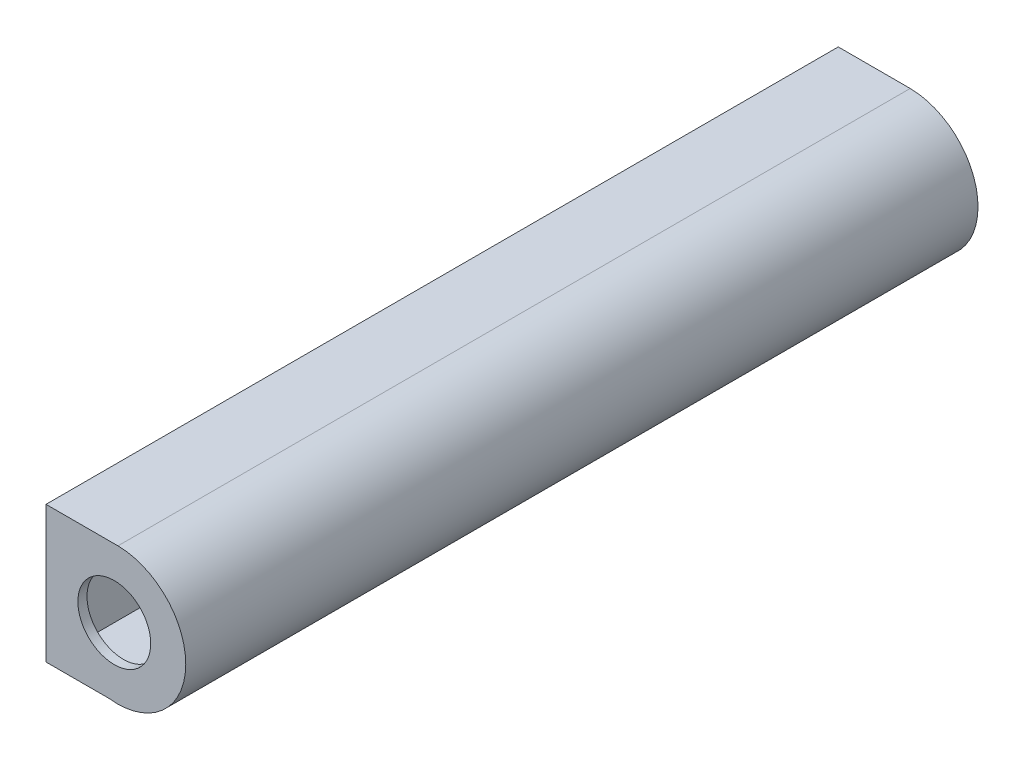
ISO-10303-21;
HEADER;
FILE_DESCRIPTION(('STEP AP214'),'2;1');
FILE_NAME('part.step','',(''),(''),'','','');
FILE_SCHEMA(('AUTOMOTIVE_DESIGN { 1 0 10303 214 1 1 1 1 }'));
ENDSEC;
DATA;
#1=APPLICATION_CONTEXT('core data for automotive mechanical design processes');
#2=APPLICATION_PROTOCOL_DEFINITION('international standard','automotive_design',2000,#1);
#3=PRODUCT_CONTEXT('',#1,'mechanical');
#4=PRODUCT('Part','Part','',(#3));
#5=PRODUCT_RELATED_PRODUCT_CATEGORY('part','',(#4));
#6=PRODUCT_DEFINITION_FORMATION('','',#4);
#7=PRODUCT_DEFINITION_CONTEXT('part definition',#1,'design');
#8=PRODUCT_DEFINITION('design','',#6,#7);
#9=PRODUCT_DEFINITION_SHAPE('','',#8);
#10=(LENGTH_UNIT() NAMED_UNIT(*) SI_UNIT(.MILLI.,.METRE.));
#11=(NAMED_UNIT(*) PLANE_ANGLE_UNIT() SI_UNIT($,.RADIAN.));
#12=(NAMED_UNIT(*) SI_UNIT($,.STERADIAN.) SOLID_ANGLE_UNIT());
#13=UNCERTAINTY_MEASURE_WITH_UNIT(LENGTH_MEASURE(1.E-05),#10,'distance_accuracy_value','');
#14=(GEOMETRIC_REPRESENTATION_CONTEXT(3) GLOBAL_UNCERTAINTY_ASSIGNED_CONTEXT((#13)) GLOBAL_UNIT_ASSIGNED_CONTEXT((#10,
#11,#12)) REPRESENTATION_CONTEXT('',''));
#15=CARTESIAN_POINT('',(0.,0.,0.));
#16=DIRECTION('',(0.,0.,1.));
#17=DIRECTION('',(1.,0.,0.));
#18=AXIS2_PLACEMENT_3D('',#15,#16,#17);
#19=CARTESIAN_POINT('',(-5.75945058146045,6.34315895413528,87.));
#20=DIRECTION('',(0.,0.,-1.));
#21=DIRECTION('',(-1.,0.,0.));
#22=AXIS2_PLACEMENT_3D('',#19,#20,#21);
#23=PLANE('',#22);
#24=CARTESIAN_POINT('',(-5.75945058146045,6.34315895413528,87.));
#25=DIRECTION('',(0.,0.,1.));
#26=DIRECTION('',(-1.,0.,0.));
#27=AXIS2_PLACEMENT_3D('',#24,#25,#26);
#28=CIRCLE('',#27,7.52928691900203);
#29=CARTESIAN_POINT('',(-6.69306965798514,-1.12802013143109,87.));
#30=VERTEX_POINT('',#29);
#31=CARTESIAN_POINT('',(-5.67568216830907,13.8719798685689,87.));
#32=VERTEX_POINT('',#31);
#33=EDGE_CURVE('E156',#30,#32,#28,.T.);
#34=ORIENTED_EDGE('',*,*,#33,.T.);
#35=DIRECTION('',(-1.,0.,0.));
#36=VECTOR('',#35,1.);
#37=CARTESIAN_POINT('',(-5.67568216830907,13.8719798685689,87.));
#38=LINE('',#37,#36);
#39=CARTESIAN_POINT('',(-13.5774526724239,13.8719798685689,87.));
#40=VERTEX_POINT('',#39);
#41=EDGE_CURVE('E160',#32,#40,#38,.T.);
#42=ORIENTED_EDGE('',*,*,#41,.T.);
#43=DIRECTION('',(0.,-1.,0.));
#44=VECTOR('',#43,1.);
#45=CARTESIAN_POINT('',(-13.5774526724239,13.8719798685689,87.));
#46=LINE('',#45,#44);
#47=CARTESIAN_POINT('',(-13.5774526724239,-1.12802013143109,87.));
#48=VERTEX_POINT('',#47);
#49=EDGE_CURVE('E163',#40,#48,#46,.T.);
#50=ORIENTED_EDGE('',*,*,#49,.T.);
#51=DIRECTION('',(1.,0.,0.));
#52=VECTOR('',#51,1.);
#53=CARTESIAN_POINT('',(-13.5774526724239,-1.12802013143109,87.));
#54=LINE('',#53,#52);
#55=EDGE_CURVE('E152',#48,#30,#54,.T.);
#56=ORIENTED_EDGE('',*,*,#55,.T.);
#57=EDGE_LOOP('',(#34,#42,#50,#56));
#58=FACE_BOUND('',#57,.T.);
#59=CARTESIAN_POINT('',(-6.07745267242387,6.37197986856891,87.));
#60=DIRECTION('',(0.,0.,1.));
#61=DIRECTION('',(1.,0.,0.));
#62=AXIS2_PLACEMENT_3D('',#59,#60,#61);
#63=CIRCLE('',#62,4.);
#64=CARTESIAN_POINT('',(-2.07745267242387,6.37197986856891,87.));
#65=VERTEX_POINT('',#64);
#66=EDGE_CURVE('E216',#65,#65,#63,.T.);
#67=ORIENTED_EDGE('',*,*,#66,.F.);
#68=EDGE_LOOP('',(#67));
#69=FACE_BOUND('',#68,.T.);
#70=ADVANCED_FACE('F39',(#58,#69),#23,.F.);
#71=CARTESIAN_POINT('',(-5.75945058146045,6.34315895413528,0.));
#72=DIRECTION('',(0.,0.,-1.));
#73=DIRECTION('',(-1.,0.,0.));
#74=AXIS2_PLACEMENT_3D('',#71,#72,#73);
#75=PLANE('',#74);
#76=DIRECTION('',(1.,0.,0.));
#77=VECTOR('',#76,1.);
#78=CARTESIAN_POINT('',(-13.5774526724239,-1.12802013143109,0.));
#79=LINE('',#78,#77);
#80=CARTESIAN_POINT('',(-13.5774526724239,-1.12802013143109,0.));
#81=VERTEX_POINT('',#80);
#82=CARTESIAN_POINT('',(-6.69306965798514,-1.12802013143109,0.));
#83=VERTEX_POINT('',#82);
#84=EDGE_CURVE('E151',#81,#83,#79,.T.);
#85=ORIENTED_EDGE('',*,*,#84,.F.);
#86=DIRECTION('',(0.,-1.,0.));
#87=VECTOR('',#86,1.);
#88=CARTESIAN_POINT('',(-13.5774526724239,13.8719798685689,0.));
#89=LINE('',#88,#87);
#90=CARTESIAN_POINT('',(-13.5774526724239,13.8719798685689,0.));
#91=VERTEX_POINT('',#90);
#92=EDGE_CURVE('E157',#91,#81,#89,.T.);
#93=ORIENTED_EDGE('',*,*,#92,.F.);
#94=DIRECTION('',(-1.,0.,0.));
#95=VECTOR('',#94,1.);
#96=CARTESIAN_POINT('',(-5.67568216830907,13.8719798685689,0.));
#97=LINE('',#96,#95);
#98=CARTESIAN_POINT('',(-5.67568216830907,13.8719798685689,0.));
#99=VERTEX_POINT('',#98);
#100=EDGE_CURVE('E174',#99,#91,#97,.T.);
#101=ORIENTED_EDGE('',*,*,#100,.F.);
#102=CARTESIAN_POINT('',(-5.75945058146045,6.34315895413528,0.));
#103=DIRECTION('',(0.,0.,1.));
#104=DIRECTION('',(-1.,0.,0.));
#105=AXIS2_PLACEMENT_3D('',#102,#103,#104);
#106=CIRCLE('',#105,7.52928691900203);
#107=EDGE_CURVE('E170',#83,#99,#106,.T.);
#108=ORIENTED_EDGE('',*,*,#107,.F.);
#109=EDGE_LOOP('',(#85,#93,#101,#108));
#110=FACE_BOUND('',#109,.T.);
#111=DIRECTION('',(1.,0.,0.));
#112=VECTOR('',#111,1.);
#113=CARTESIAN_POINT('',(-12.0774526724239,0.371979868568912,0.));
#114=LINE('',#113,#112);
#115=CARTESIAN_POINT('',(-12.0774526724239,0.371979868568912,0.));
#116=VERTEX_POINT('',#115);
#117=CARTESIAN_POINT('',(-5.87745267242388,0.371979868568913,0.));
#118=VERTEX_POINT('',#117);
#119=EDGE_CURVE('E109',#116,#118,#114,.T.);
#120=ORIENTED_EDGE('',*,*,#119,.T.);
#121=CARTESIAN_POINT('',(-5.87745267242387,6.37197986856891,0.));
#122=DIRECTION('',(0.,0.,1.));
#123=DIRECTION('',(1.,0.,0.));
#124=AXIS2_PLACEMENT_3D('',#121,#122,#123);
#125=CIRCLE('',#124,6.);
#126=CARTESIAN_POINT('',(-5.87745267242387,12.3719798685689,0.));
#127=VERTEX_POINT('',#126);
#128=EDGE_CURVE('E127',#118,#127,#125,.T.);
#129=ORIENTED_EDGE('',*,*,#128,.T.);
#130=DIRECTION('',(-1.,0.,0.));
#131=VECTOR('',#130,1.);
#132=CARTESIAN_POINT('',(-12.0774526724239,12.3719798685689,0.));
#133=LINE('',#132,#131);
#134=CARTESIAN_POINT('',(-12.0774526724239,12.3719798685689,0.));
#135=VERTEX_POINT('',#134);
#136=EDGE_CURVE('E132',#127,#135,#133,.T.);
#137=ORIENTED_EDGE('',*,*,#136,.T.);
#138=DIRECTION('',(0.,-1.,0.));
#139=VECTOR('',#138,1.);
#140=CARTESIAN_POINT('',(-12.0774526724239,12.3719798685689,0.));
#141=LINE('',#140,#139);
#142=EDGE_CURVE('E139',#135,#116,#141,.T.);
#143=ORIENTED_EDGE('',*,*,#142,.T.);
#144=EDGE_LOOP('',(#120,#129,#137,#143));
#145=FACE_BOUND('',#144,.T.);
#146=ADVANCED_FACE('F199',(#110,#145),#75,.T.);
#147=CARTESIAN_POINT('',(-13.5774526724239,-1.12802013143109,87.));
#148=DIRECTION('',(0.,1.,0.));
#149=DIRECTION('',(0.,0.,1.));
#150=AXIS2_PLACEMENT_3D('',#147,#148,#149);
#151=PLANE('',#150);
#152=ORIENTED_EDGE('',*,*,#84,.T.);
#153=DIRECTION('',(0.,0.,-1.));
#154=VECTOR('',#153,1.);
#155=CARTESIAN_POINT('',(-6.69306965798514,-1.12802013143109,87.));
#156=LINE('',#155,#154);
#157=EDGE_CURVE('E48',#30,#83,#156,.T.);
#158=ORIENTED_EDGE('',*,*,#157,.F.);
#159=ORIENTED_EDGE('',*,*,#55,.F.);
#160=DIRECTION('',(0.,0.,-1.));
#161=VECTOR('',#160,1.);
#162=CARTESIAN_POINT('',(-13.5774526724239,-1.12802013143109,87.));
#163=LINE('',#162,#161);
#164=EDGE_CURVE('E166',#48,#81,#163,.T.);
#165=ORIENTED_EDGE('',*,*,#164,.T.);
#166=EDGE_LOOP('',(#152,#158,#159,#165));
#167=FACE_BOUND('',#166,.T.);
#168=ADVANCED_FACE('F41',(#167),#151,.F.);
#169=CARTESIAN_POINT('',(-5.75945058146045,6.34315895413528,87.));
#170=DIRECTION('',(0.,0.,-1.));
#171=DIRECTION('',(-1.,0.,0.));
#172=AXIS2_PLACEMENT_3D('',#169,#170,#171);
#173=CYLINDRICAL_SURFACE('',#172,7.52928691900203);
#174=DIRECTION('',(0.,0.,-1.));
#175=VECTOR('',#174,1.);
#176=CARTESIAN_POINT('',(-5.67568216830907,13.8719798685689,87.));
#177=LINE('',#176,#175);
#178=EDGE_CURVE('E186',#32,#99,#177,.T.);
#179=ORIENTED_EDGE('',*,*,#178,.F.);
#180=ORIENTED_EDGE('',*,*,#33,.F.);
#181=ORIENTED_EDGE('',*,*,#157,.T.);
#182=ORIENTED_EDGE('',*,*,#107,.T.);
#183=EDGE_LOOP('',(#179,#180,#181,#182));
#184=FACE_BOUND('',#183,.T.);
#185=ADVANCED_FACE('F193',(#184),#173,.T.);
#186=CARTESIAN_POINT('',(-5.67568216830907,13.8719798685689,87.));
#187=DIRECTION('',(0.,-1.,0.));
#188=DIRECTION('',(0.,0.,-1.));
#189=AXIS2_PLACEMENT_3D('',#186,#187,#188);
#190=PLANE('',#189);
#191=ORIENTED_EDGE('',*,*,#100,.T.);
#192=DIRECTION('',(0.,0.,-1.));
#193=VECTOR('',#192,1.);
#194=CARTESIAN_POINT('',(-13.5774526724239,13.8719798685689,87.));
#195=LINE('',#194,#193);
#196=EDGE_CURVE('E183',#40,#91,#195,.T.);
#197=ORIENTED_EDGE('',*,*,#196,.F.);
#198=ORIENTED_EDGE('',*,*,#41,.F.);
#199=ORIENTED_EDGE('',*,*,#178,.T.);
#200=EDGE_LOOP('',(#191,#197,#198,#199));
#201=FACE_BOUND('',#200,.T.);
#202=ADVANCED_FACE('F209',(#201),#190,.F.);
#203=CARTESIAN_POINT('',(-13.5774526724239,13.8719798685689,87.));
#204=DIRECTION('',(1.,0.,0.));
#205=DIRECTION('',(0.,0.,-1.));
#206=AXIS2_PLACEMENT_3D('',#203,#204,#205);
#207=PLANE('',#206);
#208=ORIENTED_EDGE('',*,*,#92,.T.);
#209=ORIENTED_EDGE('',*,*,#164,.F.);
#210=ORIENTED_EDGE('',*,*,#49,.F.);
#211=ORIENTED_EDGE('',*,*,#196,.T.);
#212=EDGE_LOOP('',(#208,#209,#210,#211));
#213=FACE_BOUND('',#212,.T.);
#214=ADVANCED_FACE('F205',(#213),#207,.F.);
#215=CARTESIAN_POINT('',(-5.87745267242387,6.37197986856891,87.));
#216=DIRECTION('',(0.,0.,-1.));
#217=DIRECTION('',(-1.,0.,0.));
#218=AXIS2_PLACEMENT_3D('',#215,#216,#217);
#219=CYLINDRICAL_SURFACE('',#218,6.);
#220=CARTESIAN_POINT('',(-5.87745267242387,6.37197986856891,86.));
#221=DIRECTION('',(0.,0.,-1.));
#222=DIRECTION('',(-1.,0.,0.));
#223=AXIS2_PLACEMENT_3D('',#220,#221,#222);
#224=CIRCLE('',#223,6.);
#225=CARTESIAN_POINT('',(-5.87745267242387,12.3719798685689,86.));
#226=VERTEX_POINT('',#225);
#227=CARTESIAN_POINT('',(-5.87745267242388,0.371979868568913,86.));
#228=VERTEX_POINT('',#227);
#229=EDGE_CURVE('E55',#226,#228,#224,.T.);
#230=ORIENTED_EDGE('',*,*,#229,.F.);
#231=DIRECTION('',(0.,0.,-1.));
#232=VECTOR('',#231,1.);
#233=CARTESIAN_POINT('',(-5.87745267242387,12.3719798685689,87.));
#234=LINE('',#233,#232);
#235=EDGE_CURVE('E148',#226,#127,#234,.T.);
#236=ORIENTED_EDGE('',*,*,#235,.T.);
#237=ORIENTED_EDGE('',*,*,#128,.F.);
#238=DIRECTION('',(0.,0.,-1.));
#239=VECTOR('',#238,1.);
#240=CARTESIAN_POINT('',(-5.87745267242388,0.371979868568913,87.));
#241=LINE('',#240,#239);
#242=EDGE_CURVE('E115',#228,#118,#241,.T.);
#243=ORIENTED_EDGE('',*,*,#242,.F.);
#244=EDGE_LOOP('',(#230,#236,#237,#243));
#245=FACE_BOUND('',#244,.T.);
#246=ADVANCED_FACE('F240',(#245),#219,.F.);
#247=CARTESIAN_POINT('',(-12.0774526724239,12.3719798685689,87.));
#248=DIRECTION('',(0.,-1.,0.));
#249=DIRECTION('',(1.,0.,0.));
#250=AXIS2_PLACEMENT_3D('',#247,#248,#249);
#251=PLANE('',#250);
#252=DIRECTION('',(1.,0.,0.));
#253=VECTOR('',#252,1.);
#254=CARTESIAN_POINT('',(-12.0774526724239,12.3719798685689,86.));
#255=LINE('',#254,#253);
#256=CARTESIAN_POINT('',(-12.0774526724239,12.3719798685689,86.));
#257=VERTEX_POINT('',#256);
#258=EDGE_CURVE('E62',#257,#226,#255,.T.);
#259=ORIENTED_EDGE('',*,*,#258,.F.);
#260=DIRECTION('',(0.,0.,-1.));
#261=VECTOR('',#260,1.);
#262=CARTESIAN_POINT('',(-12.0774526724239,12.3719798685689,87.));
#263=LINE('',#262,#261);
#264=EDGE_CURVE('E114',#257,#135,#263,.T.);
#265=ORIENTED_EDGE('',*,*,#264,.T.);
#266=ORIENTED_EDGE('',*,*,#136,.F.);
#267=ORIENTED_EDGE('',*,*,#235,.F.);
#268=EDGE_LOOP('',(#259,#265,#266,#267));
#269=FACE_BOUND('',#268,.T.);
#270=ADVANCED_FACE('F237',(#269),#251,.T.);
#271=CARTESIAN_POINT('',(-12.0774526724239,12.3719798685689,87.));
#272=DIRECTION('',(1.,0.,0.));
#273=DIRECTION('',(0.,1.,0.));
#274=AXIS2_PLACEMENT_3D('',#271,#272,#273);
#275=PLANE('',#274);
#276=DIRECTION('',(0.,1.,0.));
#277=VECTOR('',#276,1.);
#278=CARTESIAN_POINT('',(-12.0774526724239,12.3719798685689,86.));
#279=LINE('',#278,#277);
#280=CARTESIAN_POINT('',(-12.0774526724239,0.371979868568912,86.));
#281=VERTEX_POINT('',#280);
#282=EDGE_CURVE('E118',#281,#257,#279,.T.);
#283=ORIENTED_EDGE('',*,*,#282,.F.);
#284=DIRECTION('',(0.,0.,-1.));
#285=VECTOR('',#284,1.);
#286=CARTESIAN_POINT('',(-12.0774526724239,0.371979868568912,87.));
#287=LINE('',#286,#285);
#288=EDGE_CURVE('E105',#281,#116,#287,.T.);
#289=ORIENTED_EDGE('',*,*,#288,.T.);
#290=ORIENTED_EDGE('',*,*,#142,.F.);
#291=ORIENTED_EDGE('',*,*,#264,.F.);
#292=EDGE_LOOP('',(#283,#289,#290,#291));
#293=FACE_BOUND('',#292,.T.);
#294=ADVANCED_FACE('F119',(#293),#275,.T.);
#295=CARTESIAN_POINT('',(-12.0774526724239,0.371979868568912,87.));
#296=DIRECTION('',(0.,1.,0.));
#297=DIRECTION('',(-1.,0.,0.));
#298=AXIS2_PLACEMENT_3D('',#295,#296,#297);
#299=PLANE('',#298);
#300=DIRECTION('',(-1.,0.,0.));
#301=VECTOR('',#300,1.);
#302=CARTESIAN_POINT('',(-12.0774526724239,0.371979868568912,86.));
#303=LINE('',#302,#301);
#304=EDGE_CURVE('E11',#228,#281,#303,.T.);
#305=ORIENTED_EDGE('',*,*,#304,.F.);
#306=ORIENTED_EDGE('',*,*,#242,.T.);
#307=ORIENTED_EDGE('',*,*,#119,.F.);
#308=ORIENTED_EDGE('',*,*,#288,.F.);
#309=EDGE_LOOP('',(#305,#306,#307,#308));
#310=FACE_BOUND('',#309,.T.);
#311=ADVANCED_FACE('F107',(#310),#299,.T.);
#312=CARTESIAN_POINT('',(-5.75945058146045,6.34315895413528,86.));
#313=DIRECTION('',(0.,0.,-1.));
#314=DIRECTION('',(-1.,0.,0.));
#315=AXIS2_PLACEMENT_3D('',#312,#313,#314);
#316=PLANE('',#315);
#317=ORIENTED_EDGE('',*,*,#258,.T.);
#318=ORIENTED_EDGE('',*,*,#229,.T.);
#319=ORIENTED_EDGE('',*,*,#304,.T.);
#320=ORIENTED_EDGE('',*,*,#282,.T.);
#321=EDGE_LOOP('',(#317,#318,#319,#320));
#322=FACE_BOUND('',#321,.T.);
#323=CARTESIAN_POINT('',(-6.07745267242387,6.37197986856891,86.));
#324=DIRECTION('',(0.,0.,1.));
#325=DIRECTION('',(1.,0.,0.));
#326=AXIS2_PLACEMENT_3D('',#323,#324,#325);
#327=CIRCLE('',#326,4.);
#328=CARTESIAN_POINT('',(-2.07745267242387,6.37197986856891,86.));
#329=VERTEX_POINT('',#328);
#330=EDGE_CURVE('E122',#329,#329,#327,.T.);
#331=ORIENTED_EDGE('',*,*,#330,.T.);
#332=EDGE_LOOP('',(#331));
#333=FACE_BOUND('',#332,.T.);
#334=ADVANCED_FACE('F124',(#322,#333),#316,.T.);
#335=CARTESIAN_POINT('',(-6.07745267242387,6.37197986856891,86.));
#336=DIRECTION('',(0.,0.,1.));
#337=DIRECTION('',(1.,0.,0.));
#338=AXIS2_PLACEMENT_3D('',#335,#336,#337);
#339=CYLINDRICAL_SURFACE('',#338,4.);
#340=ORIENTED_EDGE('',*,*,#330,.F.);
#341=EDGE_LOOP('',(#340));
#342=FACE_BOUND('',#341,.T.);
#343=ORIENTED_EDGE('',*,*,#66,.T.);
#344=EDGE_LOOP('',(#343));
#345=FACE_BOUND('',#344,.T.);
#346=ADVANCED_FACE('F225',(#342,#345),#339,.F.);
#347=CLOSED_SHELL('',(#70,#146,#168,#185,#202,#214,#246,#270,#294,#311,#334,#346));
#348=MANIFOLD_SOLID_BREP('B2',#347);
#349=ADVANCED_BREP_SHAPE_REPRESENTATION('',(#18,#348),#14);
#350=SHAPE_DEFINITION_REPRESENTATION(#9,#349);
ENDSEC;
END-ISO-10303-21;
